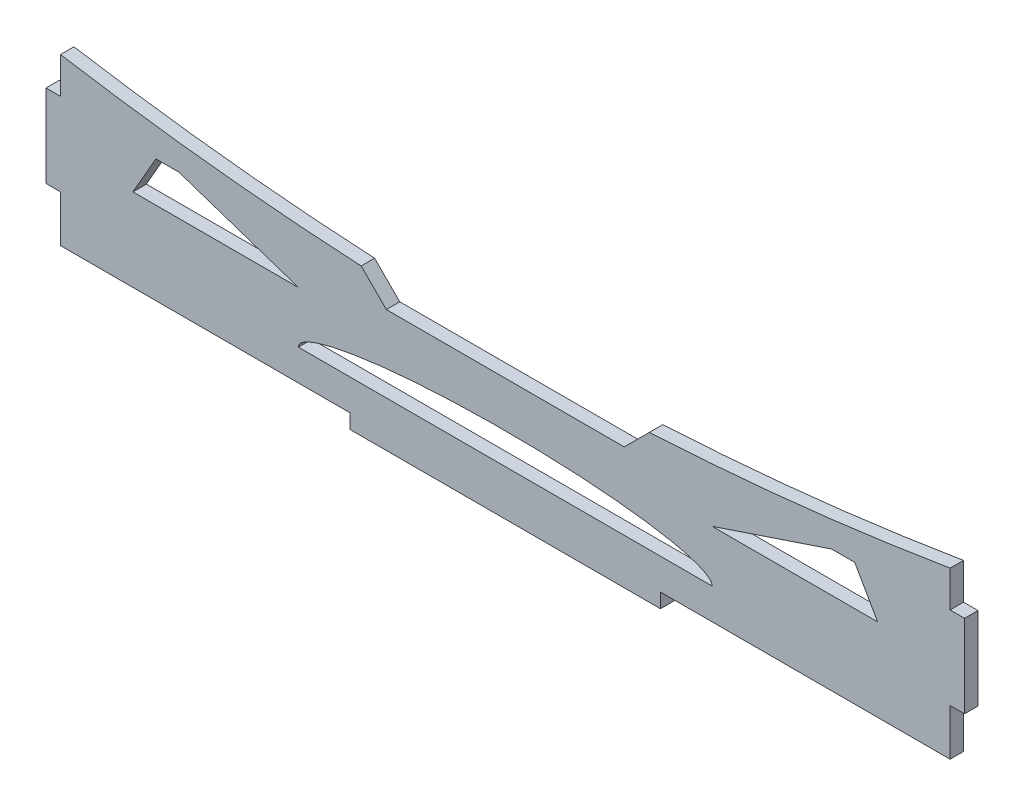
ISO-10303-21;
HEADER;
FILE_DESCRIPTION(('STEP AP214'),'2;1');
FILE_NAME('part.step','',(''),(''),'','','');
FILE_SCHEMA(('AUTOMOTIVE_DESIGN { 1 0 10303 214 1 1 1 1 }'));
ENDSEC;
DATA;
#1=APPLICATION_CONTEXT('core data for automotive mechanical design processes');
#2=APPLICATION_PROTOCOL_DEFINITION('international standard','automotive_design',2000,#1);
#3=PRODUCT_CONTEXT('',#1,'mechanical');
#4=PRODUCT('Part','Part','',(#3));
#5=PRODUCT_RELATED_PRODUCT_CATEGORY('part','',(#4));
#6=PRODUCT_DEFINITION_FORMATION('','',#4);
#7=PRODUCT_DEFINITION_CONTEXT('part definition',#1,'design');
#8=PRODUCT_DEFINITION('design','',#6,#7);
#9=PRODUCT_DEFINITION_SHAPE('','',#8);
#10=(LENGTH_UNIT() NAMED_UNIT(*) SI_UNIT(.MILLI.,.METRE.));
#11=(NAMED_UNIT(*) PLANE_ANGLE_UNIT() SI_UNIT($,.RADIAN.));
#12=(NAMED_UNIT(*) SI_UNIT($,.STERADIAN.) SOLID_ANGLE_UNIT());
#13=UNCERTAINTY_MEASURE_WITH_UNIT(LENGTH_MEASURE(1.E-05),#10,'distance_accuracy_value','');
#14=(GEOMETRIC_REPRESENTATION_CONTEXT(3) GLOBAL_UNCERTAINTY_ASSIGNED_CONTEXT((#13)) GLOBAL_UNIT_ASSIGNED_CONTEXT((#10,
#11,#12)) REPRESENTATION_CONTEXT('',''));
#15=CARTESIAN_POINT('',(0.,0.,0.));
#16=DIRECTION('',(0.,0.,1.));
#17=DIRECTION('',(1.,0.,0.));
#18=AXIS2_PLACEMENT_3D('',#15,#16,#17);
#19=CARTESIAN_POINT('',(0.,267.53039108053,0.));
#20=DIRECTION('',(0.,0.,1.));
#21=DIRECTION('',(1.,0.,0.));
#22=AXIS2_PLACEMENT_3D('',#19,#20,#21);
#23=CYLINDRICAL_SURFACE('',#22,263.068477576491);
#24=CARTESIAN_POINT('',(0.,267.53039108053,1.3));
#25=DIRECTION('',(0.,0.,1.));
#26=DIRECTION('',(1.,0.,0.));
#27=AXIS2_PLACEMENT_3D('',#24,#25,#26);
#28=CIRCLE('',#27,263.068477576491);
#29=CARTESIAN_POINT('',(-43.,8.,1.3));
#30=VERTEX_POINT('',#29);
#31=CARTESIAN_POINT('',(-13.9310380688865,4.83103806888656,1.3));
#32=VERTEX_POINT('',#31);
#33=EDGE_CURVE('E420',#30,#32,#28,.T.);
#34=ORIENTED_EDGE('',*,*,#33,.T.);
#35=DIRECTION('',(0.,0.,1.));
#36=VECTOR('',#35,1.);
#37=CARTESIAN_POINT('',(-13.9310380688865,4.83103806888656,0.));
#38=LINE('',#37,#36);
#39=CARTESIAN_POINT('',(-13.9310380688865,4.83103806888656,0.));
#40=VERTEX_POINT('',#39);
#41=EDGE_CURVE('E279',#40,#32,#38,.T.);
#42=ORIENTED_EDGE('',*,*,#41,.F.);
#43=CARTESIAN_POINT('',(0.,267.53039108053,0.));
#44=DIRECTION('',(0.,0.,1.));
#45=DIRECTION('',(1.,0.,0.));
#46=AXIS2_PLACEMENT_3D('',#43,#44,#45);
#47=CIRCLE('',#46,263.068477576491);
#48=CARTESIAN_POINT('',(-43.,8.,0.));
#49=VERTEX_POINT('',#48);
#50=EDGE_CURVE('E265',#49,#40,#47,.T.);
#51=ORIENTED_EDGE('',*,*,#50,.F.);
#52=DIRECTION('',(0.,0.,-1.));
#53=VECTOR('',#52,1.);
#54=CARTESIAN_POINT('',(-43.,8.,1.3));
#55=LINE('',#54,#53);
#56=EDGE_CURVE('E51',#30,#49,#55,.T.);
#57=ORIENTED_EDGE('',*,*,#56,.F.);
#58=EDGE_LOOP('',(#34,#42,#51,#57));
#59=FACE_BOUND('',#58,.T.);
#60=ADVANCED_FACE('F42',(#59),#23,.F.);
#61=CARTESIAN_POINT('',(-43.,-8.,1.3));
#62=DIRECTION('',(0.,1.,0.));
#63=DIRECTION('',(0.,0.,1.));
#64=AXIS2_PLACEMENT_3D('',#61,#62,#63);
#65=PLANE('',#64);
#66=DIRECTION('',(0.,0.,1.));
#67=VECTOR('',#66,1.);
#68=CARTESIAN_POINT('',(15.,-8.,0.));
#69=LINE('',#68,#67);
#70=CARTESIAN_POINT('',(15.,-8.,0.));
#71=VERTEX_POINT('',#70);
#72=CARTESIAN_POINT('',(15.,-8.,1.3));
#73=VERTEX_POINT('',#72);
#74=EDGE_CURVE('E525',#71,#73,#69,.T.);
#75=ORIENTED_EDGE('',*,*,#74,.F.);
#76=DIRECTION('',(1.,0.,0.));
#77=VECTOR('',#76,1.);
#78=CARTESIAN_POINT('',(-43.,-8.,0.));
#79=LINE('',#78,#77);
#80=CARTESIAN_POINT('',(43.,-8.,0.));
#81=VERTEX_POINT('',#80);
#82=EDGE_CURVE('E650',#71,#81,#79,.T.);
#83=ORIENTED_EDGE('',*,*,#82,.T.);
#84=DIRECTION('',(0.,0.,-1.));
#85=VECTOR('',#84,1.);
#86=CARTESIAN_POINT('',(43.,-8.,1.3));
#87=LINE('',#86,#85);
#88=CARTESIAN_POINT('',(43.,-8.,1.3));
#89=VERTEX_POINT('',#88);
#90=EDGE_CURVE('E641',#89,#81,#87,.T.);
#91=ORIENTED_EDGE('',*,*,#90,.F.);
#92=DIRECTION('',(1.,0.,0.));
#93=VECTOR('',#92,1.);
#94=CARTESIAN_POINT('',(-43.,-8.,1.3));
#95=LINE('',#94,#93);
#96=EDGE_CURVE('E636',#73,#89,#95,.T.);
#97=ORIENTED_EDGE('',*,*,#96,.F.);
#98=EDGE_LOOP('',(#75,#83,#91,#97));
#99=FACE_BOUND('',#98,.T.);
#100=ADVANCED_FACE('F397',(#99),#65,.F.);
#101=CARTESIAN_POINT('',(43.,8.,1.3));
#102=DIRECTION('',(-1.,0.,0.));
#103=DIRECTION('',(0.,0.,1.));
#104=AXIS2_PLACEMENT_3D('',#101,#102,#103);
#105=PLANE('',#104);
#106=DIRECTION('',(0.,0.,1.));
#107=VECTOR('',#106,1.);
#108=CARTESIAN_POINT('',(43.,4.5,0.));
#109=LINE('',#108,#107);
#110=CARTESIAN_POINT('',(43.,4.5,0.));
#111=VERTEX_POINT('',#110);
#112=CARTESIAN_POINT('',(43.,4.5,1.3));
#113=VERTEX_POINT('',#112);
#114=EDGE_CURVE('E545',#111,#113,#109,.T.);
#115=ORIENTED_EDGE('',*,*,#114,.F.);
#116=DIRECTION('',(0.,1.,0.));
#117=VECTOR('',#116,1.);
#118=CARTESIAN_POINT('',(43.,8.,0.));
#119=LINE('',#118,#117);
#120=CARTESIAN_POINT('',(43.,8.,0.));
#121=VERTEX_POINT('',#120);
#122=EDGE_CURVE('E617',#111,#121,#119,.T.);
#123=ORIENTED_EDGE('',*,*,#122,.T.);
#124=DIRECTION('',(0.,0.,-1.));
#125=VECTOR('',#124,1.);
#126=CARTESIAN_POINT('',(43.,8.,1.3));
#127=LINE('',#126,#125);
#128=CARTESIAN_POINT('',(43.,8.,1.3));
#129=VERTEX_POINT('',#128);
#130=EDGE_CURVE('E11',#129,#121,#127,.T.);
#131=ORIENTED_EDGE('',*,*,#130,.F.);
#132=DIRECTION('',(0.,1.,0.));
#133=VECTOR('',#132,1.);
#134=CARTESIAN_POINT('',(43.,8.,1.3));
#135=LINE('',#134,#133);
#136=EDGE_CURVE('E632',#113,#129,#135,.T.);
#137=ORIENTED_EDGE('',*,*,#136,.F.);
#138=EDGE_LOOP('',(#115,#123,#131,#137));
#139=FACE_BOUND('',#138,.T.);
#140=ADVANCED_FACE('F407',(#139),#105,.F.);
#141=CARTESIAN_POINT('',(-43.,8.,1.3));
#142=DIRECTION('',(1.,0.,0.));
#143=DIRECTION('',(0.,0.,-1.));
#144=AXIS2_PLACEMENT_3D('',#141,#142,#143);
#145=PLANE('',#144);
#146=DIRECTION('',(0.,0.,1.));
#147=VECTOR('',#146,1.);
#148=CARTESIAN_POINT('',(-43.,-3.5,0.));
#149=LINE('',#148,#147);
#150=CARTESIAN_POINT('',(-43.,-3.5,0.));
#151=VERTEX_POINT('',#150);
#152=CARTESIAN_POINT('',(-43.,-3.5,1.3));
#153=VERTEX_POINT('',#152);
#154=EDGE_CURVE('E614',#151,#153,#149,.T.);
#155=ORIENTED_EDGE('',*,*,#154,.F.);
#156=DIRECTION('',(0.,-1.,0.));
#157=VECTOR('',#156,1.);
#158=CARTESIAN_POINT('',(-43.,8.,0.));
#159=LINE('',#158,#157);
#160=CARTESIAN_POINT('',(-43.,-8.,0.));
#161=VERTEX_POINT('',#160);
#162=EDGE_CURVE('E646',#151,#161,#159,.T.);
#163=ORIENTED_EDGE('',*,*,#162,.T.);
#164=DIRECTION('',(0.,0.,-1.));
#165=VECTOR('',#164,1.);
#166=CARTESIAN_POINT('',(-43.,-8.,1.3));
#167=LINE('',#166,#165);
#168=CARTESIAN_POINT('',(-43.,-8.,1.3));
#169=VERTEX_POINT('',#168);
#170=EDGE_CURVE('E658',#169,#161,#167,.T.);
#171=ORIENTED_EDGE('',*,*,#170,.F.);
#172=DIRECTION('',(0.,-1.,0.));
#173=VECTOR('',#172,1.);
#174=CARTESIAN_POINT('',(-43.,8.,1.3));
#175=LINE('',#174,#173);
#176=EDGE_CURVE('E631',#153,#169,#175,.T.);
#177=ORIENTED_EDGE('',*,*,#176,.F.);
#178=EDGE_LOOP('',(#155,#163,#171,#177));
#179=FACE_BOUND('',#178,.T.);
#180=ADVANCED_FACE('F400',(#179),#145,.F.);
#181=CARTESIAN_POINT('',(43.,-3.5,0.));
#182=VERTEX_POINT('',#181);
#183=EDGE_CURVE('E642',#81,#182,#119,.T.);
#184=ORIENTED_EDGE('',*,*,#183,.T.);
#185=DIRECTION('',(0.,0.,1.));
#186=VECTOR('',#185,1.);
#187=CARTESIAN_POINT('',(43.,-3.5,0.));
#188=LINE('',#187,#186);
#189=CARTESIAN_POINT('',(43.,-3.5,1.3));
#190=VERTEX_POINT('',#189);
#191=EDGE_CURVE('E555',#182,#190,#188,.T.);
#192=ORIENTED_EDGE('',*,*,#191,.T.);
#193=EDGE_CURVE('E627',#89,#190,#135,.T.);
#194=ORIENTED_EDGE('',*,*,#193,.F.);
#195=ORIENTED_EDGE('',*,*,#90,.T.);
#196=EDGE_LOOP('',(#184,#192,#194,#195));
#197=FACE_BOUND('',#196,.T.);
#198=ADVANCED_FACE('F44',(#197),#105,.F.);
#199=CARTESIAN_POINT('',(-43.,4.5,0.));
#200=VERTEX_POINT('',#199);
#201=EDGE_CURVE('E647',#49,#200,#159,.T.);
#202=ORIENTED_EDGE('',*,*,#201,.T.);
#203=DIRECTION('',(0.,0.,1.));
#204=VECTOR('',#203,1.);
#205=CARTESIAN_POINT('',(-43.,4.5,0.));
#206=LINE('',#205,#204);
#207=CARTESIAN_POINT('',(-43.,4.5,1.3));
#208=VERTEX_POINT('',#207);
#209=EDGE_CURVE('E603',#200,#208,#206,.T.);
#210=ORIENTED_EDGE('',*,*,#209,.T.);
#211=EDGE_CURVE('E633',#30,#208,#175,.T.);
#212=ORIENTED_EDGE('',*,*,#211,.F.);
#213=ORIENTED_EDGE('',*,*,#56,.T.);
#214=EDGE_LOOP('',(#202,#210,#212,#213));
#215=FACE_BOUND('',#214,.T.);
#216=ADVANCED_FACE('F395',(#215),#145,.F.);
#217=CARTESIAN_POINT('',(-15.,-8.,0.));
#218=VERTEX_POINT('',#217);
#219=EDGE_CURVE('E651',#161,#218,#79,.T.);
#220=ORIENTED_EDGE('',*,*,#219,.T.);
#221=DIRECTION('',(0.,0.,1.));
#222=VECTOR('',#221,1.);
#223=CARTESIAN_POINT('',(-15.,-8.,0.));
#224=LINE('',#223,#222);
#225=CARTESIAN_POINT('',(-15.,-8.,1.3));
#226=VERTEX_POINT('',#225);
#227=EDGE_CURVE('E528',#218,#226,#224,.T.);
#228=ORIENTED_EDGE('',*,*,#227,.T.);
#229=EDGE_CURVE('E637',#169,#226,#95,.T.);
#230=ORIENTED_EDGE('',*,*,#229,.F.);
#231=ORIENTED_EDGE('',*,*,#170,.T.);
#232=EDGE_LOOP('',(#220,#228,#230,#231));
#233=FACE_BOUND('',#232,.T.);
#234=ADVANCED_FACE('F390',(#233),#65,.F.);
#235=CARTESIAN_POINT('',(0.,0.,1.3));
#236=DIRECTION('',(0.,0.,1.));
#237=DIRECTION('',(1.,0.,0.));
#238=AXIS2_PLACEMENT_3D('',#235,#236,#237);
#239=PLANE('',#238);
#240=DIRECTION('',(0.707106781186542,-0.707106781186553,0.));
#241=VECTOR('',#240,1.);
#242=CARTESIAN_POINT('',(-4.55000000000009,-4.55000000000002,1.3));
#243=LINE('',#242,#241);
#244=CARTESIAN_POINT('',(-11.5,2.4,1.3));
#245=VERTEX_POINT('',#244);
#246=EDGE_CURVE('E245',#32,#245,#243,.T.);
#247=ORIENTED_EDGE('',*,*,#246,.F.);
#248=ORIENTED_EDGE('',*,*,#33,.F.);
#249=ORIENTED_EDGE('',*,*,#211,.T.);
#250=DIRECTION('',(-1.,0.,0.));
#251=VECTOR('',#250,1.);
#252=CARTESIAN_POINT('',(-43.,4.5,1.3));
#253=LINE('',#252,#251);
#254=CARTESIAN_POINT('',(-44.4,4.5,1.3));
#255=VERTEX_POINT('',#254);
#256=EDGE_CURVE('E581',#208,#255,#253,.T.);
#257=ORIENTED_EDGE('',*,*,#256,.T.);
#258=DIRECTION('',(0.,-1.,0.));
#259=VECTOR('',#258,1.);
#260=CARTESIAN_POINT('',(-44.4,4.5,1.3));
#261=LINE('',#260,#259);
#262=CARTESIAN_POINT('',(-44.4,-3.5,1.3));
#263=VERTEX_POINT('',#262);
#264=EDGE_CURVE('E607',#255,#263,#261,.T.);
#265=ORIENTED_EDGE('',*,*,#264,.T.);
#266=DIRECTION('',(1.,0.,0.));
#267=VECTOR('',#266,1.);
#268=CARTESIAN_POINT('',(-43.,-3.5,1.3));
#269=LINE('',#268,#267);
#270=EDGE_CURVE('E596',#263,#153,#269,.T.);
#271=ORIENTED_EDGE('',*,*,#270,.T.);
#272=ORIENTED_EDGE('',*,*,#176,.T.);
#273=ORIENTED_EDGE('',*,*,#229,.T.);
#274=DIRECTION('',(0.,-1.,0.));
#275=VECTOR('',#274,1.);
#276=CARTESIAN_POINT('',(-15.,-8.,1.3));
#277=LINE('',#276,#275);
#278=CARTESIAN_POINT('',(-15.,-9.4,1.3));
#279=VERTEX_POINT('',#278);
#280=EDGE_CURVE('E541',#226,#279,#277,.T.);
#281=ORIENTED_EDGE('',*,*,#280,.T.);
#282=DIRECTION('',(1.,0.,0.));
#283=VECTOR('',#282,1.);
#284=CARTESIAN_POINT('',(-15.,-9.4,1.3));
#285=LINE('',#284,#283);
#286=CARTESIAN_POINT('',(15.,-9.4,1.3));
#287=VERTEX_POINT('',#286);
#288=EDGE_CURVE('E536',#279,#287,#285,.T.);
#289=ORIENTED_EDGE('',*,*,#288,.T.);
#290=DIRECTION('',(0.,1.,0.));
#291=VECTOR('',#290,1.);
#292=CARTESIAN_POINT('',(15.,-8.,1.3));
#293=LINE('',#292,#291);
#294=EDGE_CURVE('E532',#287,#73,#293,.T.);
#295=ORIENTED_EDGE('',*,*,#294,.T.);
#296=ORIENTED_EDGE('',*,*,#96,.T.);
#297=ORIENTED_EDGE('',*,*,#193,.T.);
#298=DIRECTION('',(1.,0.,0.));
#299=VECTOR('',#298,1.);
#300=CARTESIAN_POINT('',(43.,-3.5,1.3));
#301=LINE('',#300,#299);
#302=CARTESIAN_POINT('',(44.4,-3.5,1.3));
#303=VERTEX_POINT('',#302);
#304=EDGE_CURVE('E577',#190,#303,#301,.T.);
#305=ORIENTED_EDGE('',*,*,#304,.T.);
#306=DIRECTION('',(0.,1.,0.));
#307=VECTOR('',#306,1.);
#308=CARTESIAN_POINT('',(44.4,4.5,1.3));
#309=LINE('',#308,#307);
#310=CARTESIAN_POINT('',(44.4,4.5,1.3));
#311=VERTEX_POINT('',#310);
#312=EDGE_CURVE('E572',#303,#311,#309,.T.);
#313=ORIENTED_EDGE('',*,*,#312,.T.);
#314=DIRECTION('',(-1.,0.,0.));
#315=VECTOR('',#314,1.);
#316=CARTESIAN_POINT('',(43.,4.5,1.3));
#317=LINE('',#316,#315);
#318=EDGE_CURVE('E568',#311,#113,#317,.T.);
#319=ORIENTED_EDGE('',*,*,#318,.T.);
#320=ORIENTED_EDGE('',*,*,#136,.T.);
#321=CARTESIAN_POINT('',(13.9310380688866,4.83103806888657,1.3));
#322=VERTEX_POINT('',#321);
#323=EDGE_CURVE('E426',#322,#129,#28,.T.);
#324=ORIENTED_EDGE('',*,*,#323,.F.);
#325=DIRECTION('',(0.707106781186553,0.707106781186542,0.));
#326=VECTOR('',#325,1.);
#327=CARTESIAN_POINT('',(4.54999999999991,-4.54999999999998,1.3));
#328=LINE('',#327,#326);
#329=CARTESIAN_POINT('',(11.5,2.4,1.3));
#330=VERTEX_POINT('',#329);
#331=EDGE_CURVE('E267',#330,#322,#328,.T.);
#332=ORIENTED_EDGE('',*,*,#331,.F.);
#333=DIRECTION('',(1.,0.,0.));
#334=VECTOR('',#333,1.);
#335=CARTESIAN_POINT('',(0.,2.4,1.3));
#336=LINE('',#335,#334);
#337=EDGE_CURVE('E270',#245,#330,#336,.T.);
#338=ORIENTED_EDGE('',*,*,#337,.F.);
#339=EDGE_LOOP('',(#247,#248,#249,#257,#265,#271,#272,#273,#281,#289,#295,#296,#297,#305,#313,
#319,#320,#324,#332,#338));
#340=FACE_BOUND('',#339,.T.);
#341=DIRECTION('',(1.,0.,0.));
#342=VECTOR('',#341,1.);
#343=CARTESIAN_POINT('',(-20.,-5.,1.3));
#344=LINE('',#343,#342);
#345=CARTESIAN_POINT('',(-20.,-5.,1.3));
#346=VERTEX_POINT('',#345);
#347=CARTESIAN_POINT('',(20.,-5.,1.3));
#348=VERTEX_POINT('',#347);
#349=EDGE_CURVE('E58',#346,#348,#344,.T.);
#350=ORIENTED_EDGE('',*,*,#349,.F.);
#351=CARTESIAN_POINT('',(0.,-5.,1.3));
#352=DIRECTION('',(0.,0.,1.));
#353=DIRECTION('',(1.,0.,0.));
#354=AXIS2_PLACEMENT_3D('',#351,#352,#353);
#355=ELLIPSE('',#354,20.,3.);
#356=EDGE_CURVE('E296',#348,#346,#355,.T.);
#357=ORIENTED_EDGE('',*,*,#356,.F.);
#358=EDGE_LOOP('',(#350,#357));
#359=FACE_BOUND('',#358,.T.);
#360=DIRECTION('',(1.,0.,0.));
#361=VECTOR('',#360,1.);
#362=CARTESIAN_POINT('',(-36.,0.,1.3));
#363=LINE('',#362,#361);
#364=CARTESIAN_POINT('',(-36.,0.,1.3));
#365=VERTEX_POINT('',#364);
#366=CARTESIAN_POINT('',(-20.,0.,1.3));
#367=VERTEX_POINT('',#366);
#368=EDGE_CURVE('E430',#365,#367,#363,.T.);
#369=ORIENTED_EDGE('',*,*,#368,.F.);
#370=DIRECTION('',(-0.497750259899806,-0.867320401449012,0.));
#371=VECTOR('',#370,1.);
#372=CARTESIAN_POINT('',(-33.7778662459377,3.87202598354185,1.3));
#373=LINE('',#372,#371);
#374=CARTESIAN_POINT('',(-33.7778662459377,3.87202598354185,1.3));
#375=VERTEX_POINT('',#374);
#376=EDGE_CURVE('E447',#375,#365,#373,.T.);
#377=ORIENTED_EDGE('',*,*,#376,.F.);
#378=DIRECTION('',(-1.,0.,0.));
#379=VECTOR('',#378,1.);
#380=CARTESIAN_POINT('',(-31.5557324918753,3.87202598354185,1.3));
#381=LINE('',#380,#379);
#382=CARTESIAN_POINT('',(-31.5557324918753,3.87202598354185,1.3));
#383=VERTEX_POINT('',#382);
#384=EDGE_CURVE('E451',#383,#375,#381,.T.);
#385=ORIENTED_EDGE('',*,*,#384,.F.);
#386=DIRECTION('',(-0.948186980143758,0.317712843123881,0.));
#387=VECTOR('',#386,1.);
#388=CARTESIAN_POINT('',(-20.,0.,1.3));
#389=LINE('',#388,#387);
#390=EDGE_CURVE('E456',#367,#383,#389,.T.);
#391=ORIENTED_EDGE('',*,*,#390,.F.);
#392=EDGE_LOOP('',(#369,#377,#385,#391));
#393=FACE_BOUND('',#392,.T.);
#394=DIRECTION('',(-0.497750259899806,0.867320401449012,0.));
#395=VECTOR('',#394,1.);
#396=CARTESIAN_POINT('',(33.7778662459377,3.87202598354185,1.3));
#397=LINE('',#396,#395);
#398=CARTESIAN_POINT('',(36.,0.,1.3));
#399=VERTEX_POINT('',#398);
#400=CARTESIAN_POINT('',(33.7778662459377,3.87202598354185,1.3));
#401=VERTEX_POINT('',#400);
#402=EDGE_CURVE('E446',#399,#401,#397,.T.);
#403=ORIENTED_EDGE('',*,*,#402,.F.);
#404=DIRECTION('',(1.,0.,0.));
#405=VECTOR('',#404,1.);
#406=CARTESIAN_POINT('',(36.,0.,1.3));
#407=LINE('',#406,#405);
#408=CARTESIAN_POINT('',(20.,0.,1.3));
#409=VERTEX_POINT('',#408);
#410=EDGE_CURVE('E489',#409,#399,#407,.T.);
#411=ORIENTED_EDGE('',*,*,#410,.F.);
#412=DIRECTION('',(-0.948186980143758,-0.317712843123881,0.));
#413=VECTOR('',#412,1.);
#414=CARTESIAN_POINT('',(20.,0.,1.3));
#415=LINE('',#414,#413);
#416=CARTESIAN_POINT('',(31.5557324918753,3.87202598354185,1.3));
#417=VERTEX_POINT('',#416);
#418=EDGE_CURVE('E493',#417,#409,#415,.T.);
#419=ORIENTED_EDGE('',*,*,#418,.F.);
#420=DIRECTION('',(-1.,0.,0.));
#421=VECTOR('',#420,1.);
#422=CARTESIAN_POINT('',(31.5557324918753,3.87202598354185,1.3));
#423=LINE('',#422,#421);
#424=EDGE_CURVE('E498',#401,#417,#423,.T.);
#425=ORIENTED_EDGE('',*,*,#424,.F.);
#426=EDGE_LOOP('',(#403,#411,#419,#425));
#427=FACE_BOUND('',#426,.T.);
#428=ADVANCED_FACE('F387',(#340,#359,#393,#427),#239,.T.);
#429=CARTESIAN_POINT('',(0.,0.,0.));
#430=DIRECTION('',(0.,0.,1.));
#431=DIRECTION('',(1.,0.,0.));
#432=AXIS2_PLACEMENT_3D('',#429,#430,#431);
#433=PLANE('',#432);
#434=ORIENTED_EDGE('',*,*,#50,.T.);
#435=DIRECTION('',(0.707106781186542,-0.707106781186553,0.));
#436=VECTOR('',#435,1.);
#437=CARTESIAN_POINT('',(-4.55000000000009,-4.55000000000002,0.));
#438=LINE('',#437,#436);
#439=CARTESIAN_POINT('',(-11.5,2.4,0.));
#440=VERTEX_POINT('',#439);
#441=EDGE_CURVE('E242',#40,#440,#438,.T.);
#442=ORIENTED_EDGE('',*,*,#441,.T.);
#443=DIRECTION('',(1.,0.,0.));
#444=VECTOR('',#443,1.);
#445=CARTESIAN_POINT('',(0.,2.4,0.));
#446=LINE('',#445,#444);
#447=CARTESIAN_POINT('',(11.5,2.4,0.));
#448=VERTEX_POINT('',#447);
#449=EDGE_CURVE('E254',#440,#448,#446,.T.);
#450=ORIENTED_EDGE('',*,*,#449,.T.);
#451=DIRECTION('',(0.707106781186553,0.707106781186542,0.));
#452=VECTOR('',#451,1.);
#453=CARTESIAN_POINT('',(4.54999999999991,-4.54999999999998,0.));
#454=LINE('',#453,#452);
#455=CARTESIAN_POINT('',(13.9310380688866,4.83103806888656,0.));
#456=VERTEX_POINT('',#455);
#457=EDGE_CURVE('E251',#448,#456,#454,.T.);
#458=ORIENTED_EDGE('',*,*,#457,.T.);
#459=EDGE_CURVE('E425',#456,#121,#47,.T.);
#460=ORIENTED_EDGE('',*,*,#459,.T.);
#461=ORIENTED_EDGE('',*,*,#122,.F.);
#462=DIRECTION('',(-1.,0.,0.));
#463=VECTOR('',#462,1.);
#464=CARTESIAN_POINT('',(43.,4.5,0.));
#465=LINE('',#464,#463);
#466=CARTESIAN_POINT('',(44.4,4.5,0.));
#467=VERTEX_POINT('',#466);
#468=EDGE_CURVE('E559',#467,#111,#465,.T.);
#469=ORIENTED_EDGE('',*,*,#468,.F.);
#470=DIRECTION('',(0.,1.,0.));
#471=VECTOR('',#470,1.);
#472=CARTESIAN_POINT('',(44.4,4.5,0.));
#473=LINE('',#472,#471);
#474=CARTESIAN_POINT('',(44.4,-3.5,0.));
#475=VERTEX_POINT('',#474);
#476=EDGE_CURVE('E584',#475,#467,#473,.T.);
#477=ORIENTED_EDGE('',*,*,#476,.F.);
#478=DIRECTION('',(1.,0.,0.));
#479=VECTOR('',#478,1.);
#480=CARTESIAN_POINT('',(43.,-3.5,0.));
#481=LINE('',#480,#479);
#482=EDGE_CURVE('E573',#182,#475,#481,.T.);
#483=ORIENTED_EDGE('',*,*,#482,.F.);
#484=ORIENTED_EDGE('',*,*,#183,.F.);
#485=ORIENTED_EDGE('',*,*,#82,.F.);
#486=DIRECTION('',(0.,1.,0.));
#487=VECTOR('',#486,1.);
#488=CARTESIAN_POINT('',(15.,-8.,0.));
#489=LINE('',#488,#487);
#490=CARTESIAN_POINT('',(15.,-9.4,0.));
#491=VERTEX_POINT('',#490);
#492=EDGE_CURVE('E521',#491,#71,#489,.T.);
#493=ORIENTED_EDGE('',*,*,#492,.F.);
#494=DIRECTION('',(1.,0.,0.));
#495=VECTOR('',#494,1.);
#496=CARTESIAN_POINT('',(-15.,-9.4,0.));
#497=LINE('',#496,#495);
#498=CARTESIAN_POINT('',(-15.,-9.4,0.));
#499=VERTEX_POINT('',#498);
#500=EDGE_CURVE('E548',#499,#491,#497,.T.);
#501=ORIENTED_EDGE('',*,*,#500,.F.);
#502=DIRECTION('',(0.,-1.,0.));
#503=VECTOR('',#502,1.);
#504=CARTESIAN_POINT('',(-15.,-8.,0.));
#505=LINE('',#504,#503);
#506=EDGE_CURVE('E537',#218,#499,#505,.T.);
#507=ORIENTED_EDGE('',*,*,#506,.F.);
#508=ORIENTED_EDGE('',*,*,#219,.F.);
#509=ORIENTED_EDGE('',*,*,#162,.F.);
#510=DIRECTION('',(1.,0.,0.));
#511=VECTOR('',#510,1.);
#512=CARTESIAN_POINT('',(-43.,-3.5,0.));
#513=LINE('',#512,#511);
#514=CARTESIAN_POINT('',(-44.4,-3.5,0.));
#515=VERTEX_POINT('',#514);
#516=EDGE_CURVE('E600',#515,#151,#513,.T.);
#517=ORIENTED_EDGE('',*,*,#516,.F.);
#518=DIRECTION('',(0.,-1.,0.));
#519=VECTOR('',#518,1.);
#520=CARTESIAN_POINT('',(-44.4,4.5,0.));
#521=LINE('',#520,#519);
#522=CARTESIAN_POINT('',(-44.4,4.5,0.));
#523=VERTEX_POINT('',#522);
#524=EDGE_CURVE('E595',#523,#515,#521,.T.);
#525=ORIENTED_EDGE('',*,*,#524,.F.);
#526=DIRECTION('',(-1.,0.,0.));
#527=VECTOR('',#526,1.);
#528=CARTESIAN_POINT('',(-43.,4.5,0.));
#529=LINE('',#528,#527);
#530=EDGE_CURVE('E591',#200,#523,#529,.T.);
#531=ORIENTED_EDGE('',*,*,#530,.F.);
#532=ORIENTED_EDGE('',*,*,#201,.F.);
#533=EDGE_LOOP('',(#434,#442,#450,#458,#460,#461,#469,#477,#483,#484,#485,#493,#501,#507,#508,
#509,#517,#525,#531,#532));
#534=FACE_BOUND('',#533,.T.);
#535=CARTESIAN_POINT('',(0.,-5.,0.));
#536=DIRECTION('',(0.,0.,1.));
#537=DIRECTION('',(1.,0.,0.));
#538=AXIS2_PLACEMENT_3D('',#535,#536,#537);
#539=ELLIPSE('',#538,20.,3.);
#540=CARTESIAN_POINT('',(20.,-5.,0.));
#541=VERTEX_POINT('',#540);
#542=CARTESIAN_POINT('',(-20.,-5.,0.));
#543=VERTEX_POINT('',#542);
#544=EDGE_CURVE('E292',#541,#543,#539,.T.);
#545=ORIENTED_EDGE('',*,*,#544,.T.);
#546=DIRECTION('',(1.,0.,0.));
#547=VECTOR('',#546,1.);
#548=CARTESIAN_POINT('',(-20.,-5.,0.));
#549=LINE('',#548,#547);
#550=EDGE_CURVE('E63',#543,#541,#549,.T.);
#551=ORIENTED_EDGE('',*,*,#550,.T.);
#552=EDGE_LOOP('',(#545,#551));
#553=FACE_BOUND('',#552,.T.);
#554=DIRECTION('',(-0.497750259899806,-0.867320401449012,0.));
#555=VECTOR('',#554,1.);
#556=CARTESIAN_POINT('',(-33.7778662459377,3.87202598354185,0.));
#557=LINE('',#556,#555);
#558=CARTESIAN_POINT('',(-33.7778662459377,3.87202598354185,0.));
#559=VERTEX_POINT('',#558);
#560=CARTESIAN_POINT('',(-36.,0.,0.));
#561=VERTEX_POINT('',#560);
#562=EDGE_CURVE('E436',#559,#561,#557,.T.);
#563=ORIENTED_EDGE('',*,*,#562,.T.);
#564=DIRECTION('',(1.,0.,0.));
#565=VECTOR('',#564,1.);
#566=CARTESIAN_POINT('',(-36.,0.,0.));
#567=LINE('',#566,#565);
#568=CARTESIAN_POINT('',(-20.,0.,0.));
#569=VERTEX_POINT('',#568);
#570=EDGE_CURVE('E452',#561,#569,#567,.T.);
#571=ORIENTED_EDGE('',*,*,#570,.T.);
#572=DIRECTION('',(-0.948186980143758,0.317712843123881,0.));
#573=VECTOR('',#572,1.);
#574=CARTESIAN_POINT('',(-20.,0.,0.));
#575=LINE('',#574,#573);
#576=CARTESIAN_POINT('',(-31.5557324918753,3.87202598354186,0.));
#577=VERTEX_POINT('',#576);
#578=EDGE_CURVE('E469',#569,#577,#575,.T.);
#579=ORIENTED_EDGE('',*,*,#578,.T.);
#580=DIRECTION('',(-1.,0.,0.));
#581=VECTOR('',#580,1.);
#582=CARTESIAN_POINT('',(-31.5557324918753,3.87202598354185,0.));
#583=LINE('',#582,#581);
#584=EDGE_CURVE('E465',#577,#559,#583,.T.);
#585=ORIENTED_EDGE('',*,*,#584,.T.);
#586=EDGE_LOOP('',(#563,#571,#579,#585));
#587=FACE_BOUND('',#586,.T.);
#588=DIRECTION('',(1.,0.,0.));
#589=VECTOR('',#588,1.);
#590=CARTESIAN_POINT('',(36.,0.,0.));
#591=LINE('',#590,#589);
#592=CARTESIAN_POINT('',(20.,0.,0.));
#593=VERTEX_POINT('',#592);
#594=CARTESIAN_POINT('',(36.,0.,0.));
#595=VERTEX_POINT('',#594);
#596=EDGE_CURVE('E480',#593,#595,#591,.T.);
#597=ORIENTED_EDGE('',*,*,#596,.T.);
#598=DIRECTION('',(-0.497750259899806,0.867320401449012,0.));
#599=VECTOR('',#598,1.);
#600=CARTESIAN_POINT('',(33.7778662459377,3.87202598354185,0.));
#601=LINE('',#600,#599);
#602=CARTESIAN_POINT('',(33.7778662459377,3.87202598354185,0.));
#603=VERTEX_POINT('',#602);
#604=EDGE_CURVE('E494',#595,#603,#601,.T.);
#605=ORIENTED_EDGE('',*,*,#604,.T.);
#606=DIRECTION('',(-1.,0.,0.));
#607=VECTOR('',#606,1.);
#608=CARTESIAN_POINT('',(31.5557324918753,3.87202598354185,0.));
#609=LINE('',#608,#607);
#610=CARTESIAN_POINT('',(31.5557324918753,3.87202598354185,0.));
#611=VERTEX_POINT('',#610);
#612=EDGE_CURVE('E511',#603,#611,#609,.T.);
#613=ORIENTED_EDGE('',*,*,#612,.T.);
#614=DIRECTION('',(-0.948186980143758,-0.317712843123881,0.));
#615=VECTOR('',#614,1.);
#616=CARTESIAN_POINT('',(20.,0.,0.));
#617=LINE('',#616,#615);
#618=EDGE_CURVE('E507',#611,#593,#617,.T.);
#619=ORIENTED_EDGE('',*,*,#618,.T.);
#620=EDGE_LOOP('',(#597,#605,#613,#619));
#621=FACE_BOUND('',#620,.T.);
#622=ADVANCED_FACE('F262',(#534,#553,#587,#621),#433,.F.);
#623=CARTESIAN_POINT('',(-43.,-3.5,0.));
#624=DIRECTION('',(0.,-1.,0.));
#625=DIRECTION('',(1.,0.,0.));
#626=AXIS2_PLACEMENT_3D('',#623,#624,#625);
#627=PLANE('',#626);
#628=ORIENTED_EDGE('',*,*,#270,.F.);
#629=DIRECTION('',(0.,0.,1.));
#630=VECTOR('',#629,1.);
#631=CARTESIAN_POINT('',(-44.4,-3.5,0.));
#632=LINE('',#631,#630);
#633=EDGE_CURVE('E618',#515,#263,#632,.T.);
#634=ORIENTED_EDGE('',*,*,#633,.F.);
#635=ORIENTED_EDGE('',*,*,#516,.T.);
#636=ORIENTED_EDGE('',*,*,#154,.T.);
#637=EDGE_LOOP('',(#628,#634,#635,#636));
#638=FACE_BOUND('',#637,.T.);
#639=ADVANCED_FACE('F376',(#638),#627,.T.);
#640=CARTESIAN_POINT('',(-44.4,4.5,0.));
#641=DIRECTION('',(-1.,0.,0.));
#642=DIRECTION('',(0.,0.,1.));
#643=AXIS2_PLACEMENT_3D('',#640,#641,#642);
#644=PLANE('',#643);
#645=ORIENTED_EDGE('',*,*,#264,.F.);
#646=DIRECTION('',(0.,0.,1.));
#647=VECTOR('',#646,1.);
#648=CARTESIAN_POINT('',(-44.4,4.5,0.));
#649=LINE('',#648,#647);
#650=EDGE_CURVE('E621',#523,#255,#649,.T.);
#651=ORIENTED_EDGE('',*,*,#650,.F.);
#652=ORIENTED_EDGE('',*,*,#524,.T.);
#653=ORIENTED_EDGE('',*,*,#633,.T.);
#654=EDGE_LOOP('',(#645,#651,#652,#653));
#655=FACE_BOUND('',#654,.T.);
#656=ADVANCED_FACE('F379',(#655),#644,.T.);
#657=CARTESIAN_POINT('',(-43.,4.5,0.));
#658=DIRECTION('',(0.,1.,0.));
#659=DIRECTION('',(-1.,0.,0.));
#660=AXIS2_PLACEMENT_3D('',#657,#658,#659);
#661=PLANE('',#660);
#662=ORIENTED_EDGE('',*,*,#256,.F.);
#663=ORIENTED_EDGE('',*,*,#209,.F.);
#664=ORIENTED_EDGE('',*,*,#530,.T.);
#665=ORIENTED_EDGE('',*,*,#650,.T.);
#666=EDGE_LOOP('',(#662,#663,#664,#665));
#667=FACE_BOUND('',#666,.T.);
#668=ADVANCED_FACE('F374',(#667),#661,.T.);
#669=CARTESIAN_POINT('',(43.,4.5,0.));
#670=DIRECTION('',(0.,1.,0.));
#671=DIRECTION('',(0.,0.,1.));
#672=AXIS2_PLACEMENT_3D('',#669,#670,#671);
#673=PLANE('',#672);
#674=ORIENTED_EDGE('',*,*,#318,.F.);
#675=DIRECTION('',(0.,0.,1.));
#676=VECTOR('',#675,1.);
#677=CARTESIAN_POINT('',(44.4,4.5,0.));
#678=LINE('',#677,#676);
#679=EDGE_CURVE('E563',#467,#311,#678,.T.);
#680=ORIENTED_EDGE('',*,*,#679,.F.);
#681=ORIENTED_EDGE('',*,*,#468,.T.);
#682=ORIENTED_EDGE('',*,*,#114,.T.);
#683=EDGE_LOOP('',(#674,#680,#681,#682));
#684=FACE_BOUND('',#683,.T.);
#685=ADVANCED_FACE('F370',(#684),#673,.T.);
#686=CARTESIAN_POINT('',(44.4,4.5,0.));
#687=DIRECTION('',(1.,0.,0.));
#688=DIRECTION('',(0.,0.,-1.));
#689=AXIS2_PLACEMENT_3D('',#686,#687,#688);
#690=PLANE('',#689);
#691=ORIENTED_EDGE('',*,*,#312,.F.);
#692=DIRECTION('',(0.,0.,1.));
#693=VECTOR('',#692,1.);
#694=CARTESIAN_POINT('',(44.4,-3.5,0.));
#695=LINE('',#694,#693);
#696=EDGE_CURVE('E560',#475,#303,#695,.T.);
#697=ORIENTED_EDGE('',*,*,#696,.F.);
#698=ORIENTED_EDGE('',*,*,#476,.T.);
#699=ORIENTED_EDGE('',*,*,#679,.T.);
#700=EDGE_LOOP('',(#691,#697,#698,#699));
#701=FACE_BOUND('',#700,.T.);
#702=ADVANCED_FACE('F366',(#701),#690,.T.);
#703=CARTESIAN_POINT('',(43.,-3.5,0.));
#704=DIRECTION('',(0.,-1.,0.));
#705=DIRECTION('',(1.,0.,0.));
#706=AXIS2_PLACEMENT_3D('',#703,#704,#705);
#707=PLANE('',#706);
#708=ORIENTED_EDGE('',*,*,#304,.F.);
#709=ORIENTED_EDGE('',*,*,#191,.F.);
#710=ORIENTED_EDGE('',*,*,#482,.T.);
#711=ORIENTED_EDGE('',*,*,#696,.T.);
#712=EDGE_LOOP('',(#708,#709,#710,#711));
#713=FACE_BOUND('',#712,.T.);
#714=ADVANCED_FACE('F356',(#713),#707,.T.);
#715=CARTESIAN_POINT('',(-15.,-8.,0.));
#716=DIRECTION('',(-1.,0.,0.));
#717=DIRECTION('',(0.,0.,1.));
#718=AXIS2_PLACEMENT_3D('',#715,#716,#717);
#719=PLANE('',#718);
#720=ORIENTED_EDGE('',*,*,#280,.F.);
#721=ORIENTED_EDGE('',*,*,#227,.F.);
#722=ORIENTED_EDGE('',*,*,#506,.T.);
#723=DIRECTION('',(0.,0.,1.));
#724=VECTOR('',#723,1.);
#725=CARTESIAN_POINT('',(-15.,-9.4,0.));
#726=LINE('',#725,#724);
#727=EDGE_CURVE('E518',#499,#279,#726,.T.);
#728=ORIENTED_EDGE('',*,*,#727,.T.);
#729=EDGE_LOOP('',(#720,#721,#722,#728));
#730=FACE_BOUND('',#729,.T.);
#731=ADVANCED_FACE('F352',(#730),#719,.T.);
#732=CARTESIAN_POINT('',(15.,-8.,0.));
#733=DIRECTION('',(1.,0.,0.));
#734=DIRECTION('',(0.,0.,-1.));
#735=AXIS2_PLACEMENT_3D('',#732,#733,#734);
#736=PLANE('',#735);
#737=ORIENTED_EDGE('',*,*,#294,.F.);
#738=DIRECTION('',(0.,0.,1.));
#739=VECTOR('',#738,1.);
#740=CARTESIAN_POINT('',(15.,-9.4,0.));
#741=LINE('',#740,#739);
#742=EDGE_CURVE('E522',#491,#287,#741,.T.);
#743=ORIENTED_EDGE('',*,*,#742,.F.);
#744=ORIENTED_EDGE('',*,*,#492,.T.);
#745=ORIENTED_EDGE('',*,*,#74,.T.);
#746=EDGE_LOOP('',(#737,#743,#744,#745));
#747=FACE_BOUND('',#746,.T.);
#748=ADVANCED_FACE('F355',(#747),#736,.T.);
#749=CARTESIAN_POINT('',(-15.,-9.4,0.));
#750=DIRECTION('',(0.,-1.,0.));
#751=DIRECTION('',(1.,0.,0.));
#752=AXIS2_PLACEMENT_3D('',#749,#750,#751);
#753=PLANE('',#752);
#754=ORIENTED_EDGE('',*,*,#288,.F.);
#755=ORIENTED_EDGE('',*,*,#727,.F.);
#756=ORIENTED_EDGE('',*,*,#500,.T.);
#757=ORIENTED_EDGE('',*,*,#742,.T.);
#758=EDGE_LOOP('',(#754,#755,#756,#757));
#759=FACE_BOUND('',#758,.T.);
#760=ADVANCED_FACE('F340',(#759),#753,.T.);
#761=CARTESIAN_POINT('',(33.7778662459377,3.87202598354185,0.));
#762=DIRECTION('',(0.867320401449012,0.497750259899806,0.));
#763=DIRECTION('',(-0.497750259899806,0.867320401449012,0.));
#764=AXIS2_PLACEMENT_3D('',#761,#762,#763);
#765=PLANE('',#764);
#766=ORIENTED_EDGE('',*,*,#402,.T.);
#767=DIRECTION('',(0.,0.,1.));
#768=VECTOR('',#767,1.);
#769=CARTESIAN_POINT('',(33.7778662459377,3.87202598354185,0.));
#770=LINE('',#769,#768);
#771=EDGE_CURVE('E476',#603,#401,#770,.T.);
#772=ORIENTED_EDGE('',*,*,#771,.F.);
#773=ORIENTED_EDGE('',*,*,#604,.F.);
#774=DIRECTION('',(0.,0.,1.));
#775=VECTOR('',#774,1.);
#776=CARTESIAN_POINT('',(36.,0.,0.));
#777=LINE('',#776,#775);
#778=EDGE_CURVE('E282',#595,#399,#777,.T.);
#779=ORIENTED_EDGE('',*,*,#778,.T.);
#780=EDGE_LOOP('',(#766,#772,#773,#779));
#781=FACE_BOUND('',#780,.T.);
#782=ADVANCED_FACE('F336',(#781),#765,.F.);
#783=CARTESIAN_POINT('',(36.,0.,0.));
#784=DIRECTION('',(0.,-1.,0.));
#785=DIRECTION('',(1.,0.,0.));
#786=AXIS2_PLACEMENT_3D('',#783,#784,#785);
#787=PLANE('',#786);
#788=ORIENTED_EDGE('',*,*,#410,.T.);
#789=ORIENTED_EDGE('',*,*,#778,.F.);
#790=ORIENTED_EDGE('',*,*,#596,.F.);
#791=DIRECTION('',(0.,0.,1.));
#792=VECTOR('',#791,1.);
#793=CARTESIAN_POINT('',(20.,0.,0.));
#794=LINE('',#793,#792);
#795=EDGE_CURVE('E484',#593,#409,#794,.T.);
#796=ORIENTED_EDGE('',*,*,#795,.T.);
#797=EDGE_LOOP('',(#788,#789,#790,#796));
#798=FACE_BOUND('',#797,.T.);
#799=ADVANCED_FACE('F339',(#798),#787,.F.);
#800=CARTESIAN_POINT('',(20.,0.,0.));
#801=DIRECTION('',(-0.317712843123881,0.948186980143758,0.));
#802=DIRECTION('',(-0.948186980143758,-0.317712843123881,0.));
#803=AXIS2_PLACEMENT_3D('',#800,#801,#802);
#804=PLANE('',#803);
#805=ORIENTED_EDGE('',*,*,#418,.T.);
#806=ORIENTED_EDGE('',*,*,#795,.F.);
#807=ORIENTED_EDGE('',*,*,#618,.F.);
#808=DIRECTION('',(0.,0.,1.));
#809=VECTOR('',#808,1.);
#810=CARTESIAN_POINT('',(31.5557324918753,3.87202598354185,0.));
#811=LINE('',#810,#809);
#812=EDGE_CURVE('E481',#611,#417,#811,.T.);
#813=ORIENTED_EDGE('',*,*,#812,.T.);
#814=EDGE_LOOP('',(#805,#806,#807,#813));
#815=FACE_BOUND('',#814,.T.);
#816=ADVANCED_FACE('F344',(#815),#804,.F.);
#817=CARTESIAN_POINT('',(31.5557324918753,3.87202598354185,0.));
#818=DIRECTION('',(0.,1.,0.));
#819=DIRECTION('',(0.,0.,1.));
#820=AXIS2_PLACEMENT_3D('',#817,#818,#819);
#821=PLANE('',#820);
#822=ORIENTED_EDGE('',*,*,#424,.T.);
#823=ORIENTED_EDGE('',*,*,#812,.F.);
#824=ORIENTED_EDGE('',*,*,#612,.F.);
#825=ORIENTED_EDGE('',*,*,#771,.T.);
#826=EDGE_LOOP('',(#822,#823,#824,#825));
#827=FACE_BOUND('',#826,.T.);
#828=ADVANCED_FACE('F324',(#827),#821,.F.);
#829=CARTESIAN_POINT('',(-36.,0.,0.));
#830=DIRECTION('',(0.,-1.,0.));
#831=DIRECTION('',(1.,0.,0.));
#832=AXIS2_PLACEMENT_3D('',#829,#830,#831);
#833=PLANE('',#832);
#834=ORIENTED_EDGE('',*,*,#368,.T.);
#835=DIRECTION('',(0.,0.,1.));
#836=VECTOR('',#835,1.);
#837=CARTESIAN_POINT('',(-20.,0.,0.));
#838=LINE('',#837,#836);
#839=EDGE_CURVE('E432',#569,#367,#838,.T.);
#840=ORIENTED_EDGE('',*,*,#839,.F.);
#841=ORIENTED_EDGE('',*,*,#570,.F.);
#842=DIRECTION('',(0.,0.,1.));
#843=VECTOR('',#842,1.);
#844=CARTESIAN_POINT('',(-36.,0.,0.));
#845=LINE('',#844,#843);
#846=EDGE_CURVE('E443',#561,#365,#845,.T.);
#847=ORIENTED_EDGE('',*,*,#846,.T.);
#848=EDGE_LOOP('',(#834,#840,#841,#847));
#849=FACE_BOUND('',#848,.T.);
#850=ADVANCED_FACE('F320',(#849),#833,.F.);
#851=CARTESIAN_POINT('',(-33.7778662459377,3.87202598354185,0.));
#852=DIRECTION('',(-0.867320401449012,0.497750259899806,0.));
#853=DIRECTION('',(-0.497750259899806,-0.867320401449012,0.));
#854=AXIS2_PLACEMENT_3D('',#851,#852,#853);
#855=PLANE('',#854);
#856=ORIENTED_EDGE('',*,*,#376,.T.);
#857=ORIENTED_EDGE('',*,*,#846,.F.);
#858=ORIENTED_EDGE('',*,*,#562,.F.);
#859=DIRECTION('',(0.,0.,1.));
#860=VECTOR('',#859,1.);
#861=CARTESIAN_POINT('',(-33.7778662459377,3.87202598354185,0.));
#862=LINE('',#861,#860);
#863=EDGE_CURVE('E440',#559,#375,#862,.T.);
#864=ORIENTED_EDGE('',*,*,#863,.T.);
#865=EDGE_LOOP('',(#856,#857,#858,#864));
#866=FACE_BOUND('',#865,.T.);
#867=ADVANCED_FACE('F323',(#866),#855,.F.);
#868=CARTESIAN_POINT('',(-31.5557324918753,3.87202598354185,0.));
#869=DIRECTION('',(0.,1.,0.));
#870=DIRECTION('',(0.,0.,1.));
#871=AXIS2_PLACEMENT_3D('',#868,#869,#870);
#872=PLANE('',#871);
#873=ORIENTED_EDGE('',*,*,#384,.T.);
#874=ORIENTED_EDGE('',*,*,#863,.F.);
#875=ORIENTED_EDGE('',*,*,#584,.F.);
#876=DIRECTION('',(0.,0.,1.));
#877=VECTOR('',#876,1.);
#878=CARTESIAN_POINT('',(-31.5557324918753,3.87202598354185,0.));
#879=LINE('',#878,#877);
#880=EDGE_CURVE('E437',#577,#383,#879,.T.);
#881=ORIENTED_EDGE('',*,*,#880,.T.);
#882=EDGE_LOOP('',(#873,#874,#875,#881));
#883=FACE_BOUND('',#882,.T.);
#884=ADVANCED_FACE('F328',(#883),#872,.F.);
#885=CARTESIAN_POINT('',(-20.,0.,0.));
#886=DIRECTION('',(0.317712843123881,0.948186980143758,0.));
#887=DIRECTION('',(-0.948186980143758,0.317712843123881,0.));
#888=AXIS2_PLACEMENT_3D('',#885,#886,#887);
#889=PLANE('',#888);
#890=ORIENTED_EDGE('',*,*,#390,.T.);
#891=ORIENTED_EDGE('',*,*,#880,.F.);
#892=ORIENTED_EDGE('',*,*,#578,.F.);
#893=ORIENTED_EDGE('',*,*,#839,.T.);
#894=EDGE_LOOP('',(#890,#891,#892,#893));
#895=FACE_BOUND('',#894,.T.);
#896=ADVANCED_FACE('F318',(#895),#889,.F.);
#897=ORIENTED_EDGE('',*,*,#459,.F.);
#898=DIRECTION('',(0.,0.,1.));
#899=VECTOR('',#898,1.);
#900=CARTESIAN_POINT('',(13.9310380688866,4.83103806888656,0.));
#901=LINE('',#900,#899);
#902=EDGE_CURVE('E283',#456,#322,#901,.T.);
#903=ORIENTED_EDGE('',*,*,#902,.T.);
#904=ORIENTED_EDGE('',*,*,#323,.T.);
#905=ORIENTED_EDGE('',*,*,#130,.T.);
#906=EDGE_LOOP('',(#897,#903,#904,#905));
#907=FACE_BOUND('',#906,.T.);
#908=ADVANCED_FACE('F315',(#907),#23,.F.);
#909=CARTESIAN_POINT('',(-4.55000000000009,-4.55000000000002,0.));
#910=DIRECTION('',(-0.707106781186553,-0.707106781186542,0.));
#911=DIRECTION('',(0.707106781186542,-0.707106781186553,0.));
#912=AXIS2_PLACEMENT_3D('',#909,#910,#911);
#913=PLANE('',#912);
#914=ORIENTED_EDGE('',*,*,#246,.T.);
#915=DIRECTION('',(0.,0.,1.));
#916=VECTOR('',#915,1.);
#917=CARTESIAN_POINT('',(-11.5,2.4,0.));
#918=LINE('',#917,#916);
#919=EDGE_CURVE('E238',#440,#245,#918,.T.);
#920=ORIENTED_EDGE('',*,*,#919,.F.);
#921=ORIENTED_EDGE('',*,*,#441,.F.);
#922=ORIENTED_EDGE('',*,*,#41,.T.);
#923=EDGE_LOOP('',(#914,#920,#921,#922));
#924=FACE_BOUND('',#923,.T.);
#925=ADVANCED_FACE('F240',(#924),#913,.F.);
#926=CARTESIAN_POINT('',(4.54999999999991,-4.54999999999998,0.));
#927=DIRECTION('',(0.707106781186542,-0.707106781186553,0.));
#928=DIRECTION('',(0.707106781186553,0.707106781186542,0.));
#929=AXIS2_PLACEMENT_3D('',#926,#927,#928);
#930=PLANE('',#929);
#931=ORIENTED_EDGE('',*,*,#331,.T.);
#932=ORIENTED_EDGE('',*,*,#902,.F.);
#933=ORIENTED_EDGE('',*,*,#457,.F.);
#934=DIRECTION('',(0.,0.,1.));
#935=VECTOR('',#934,1.);
#936=CARTESIAN_POINT('',(11.5,2.4,0.));
#937=LINE('',#936,#935);
#938=EDGE_CURVE('E250',#448,#330,#937,.T.);
#939=ORIENTED_EDGE('',*,*,#938,.T.);
#940=EDGE_LOOP('',(#931,#932,#933,#939));
#941=FACE_BOUND('',#940,.T.);
#942=ADVANCED_FACE('F708',(#941),#930,.F.);
#943=CARTESIAN_POINT('',(0.,2.4,0.));
#944=DIRECTION('',(0.,-1.,0.));
#945=DIRECTION('',(0.,0.,-1.));
#946=AXIS2_PLACEMENT_3D('',#943,#944,#945);
#947=PLANE('',#946);
#948=ORIENTED_EDGE('',*,*,#337,.T.);
#949=ORIENTED_EDGE('',*,*,#938,.F.);
#950=ORIENTED_EDGE('',*,*,#449,.F.);
#951=ORIENTED_EDGE('',*,*,#919,.T.);
#952=EDGE_LOOP('',(#948,#949,#950,#951));
#953=FACE_BOUND('',#952,.T.);
#954=ADVANCED_FACE('F255',(#953),#947,.F.);
#955=CARTESIAN_POINT('',(-20.,-5.,0.));
#956=DIRECTION('',(0.,-1.,0.));
#957=DIRECTION('',(0.,0.,-1.));
#958=AXIS2_PLACEMENT_3D('',#955,#956,#957);
#959=PLANE('',#958);
#960=ORIENTED_EDGE('',*,*,#349,.T.);
#961=DIRECTION('',(0.,0.,1.));
#962=VECTOR('',#961,1.);
#963=CARTESIAN_POINT('',(20.,-5.,0.));
#964=LINE('',#963,#962);
#965=EDGE_CURVE('E289',#541,#348,#964,.T.);
#966=ORIENTED_EDGE('',*,*,#965,.F.);
#967=ORIENTED_EDGE('',*,*,#550,.F.);
#968=DIRECTION('',(0.,0.,1.));
#969=VECTOR('',#968,1.);
#970=CARTESIAN_POINT('',(-20.,-5.,0.));
#971=LINE('',#970,#969);
#972=EDGE_CURVE('E293',#543,#346,#971,.T.);
#973=ORIENTED_EDGE('',*,*,#972,.T.);
#974=EDGE_LOOP('',(#960,#966,#967,#973));
#975=FACE_BOUND('',#974,.T.);
#976=ADVANCED_FACE('F312',(#975),#959,.F.);
#977=DIRECTION('',(0.,0.,1.));
#978=VECTOR('',#977,1.);
#979=SURFACE_OF_LINEAR_EXTRUSION('',#539,#978);
#980=ORIENTED_EDGE('',*,*,#356,.T.);
#981=ORIENTED_EDGE('',*,*,#972,.F.);
#982=ORIENTED_EDGE('',*,*,#544,.F.);
#983=ORIENTED_EDGE('',*,*,#965,.T.);
#984=EDGE_LOOP('',(#980,#981,#982,#983));
#985=FACE_BOUND('',#984,.T.);
#986=ADVANCED_FACE('F308',(#985),#979,.F.);
#987=CLOSED_SHELL('',(#60,#100,#140,#180,#198,#216,#234,#428,#622,#639,#656,#668,#685,#702,#714,
#731,#748,#760,#782,#799,#816,#828,#850,#867,#884,#896,#908,#925,#942,#954,#976,#986));
#988=MANIFOLD_SOLID_BREP('B2',#987);
#989=ADVANCED_BREP_SHAPE_REPRESENTATION('',(#18,#988),#14);
#990=SHAPE_DEFINITION_REPRESENTATION(#9,#989);
ENDSEC;
END-ISO-10303-21;
